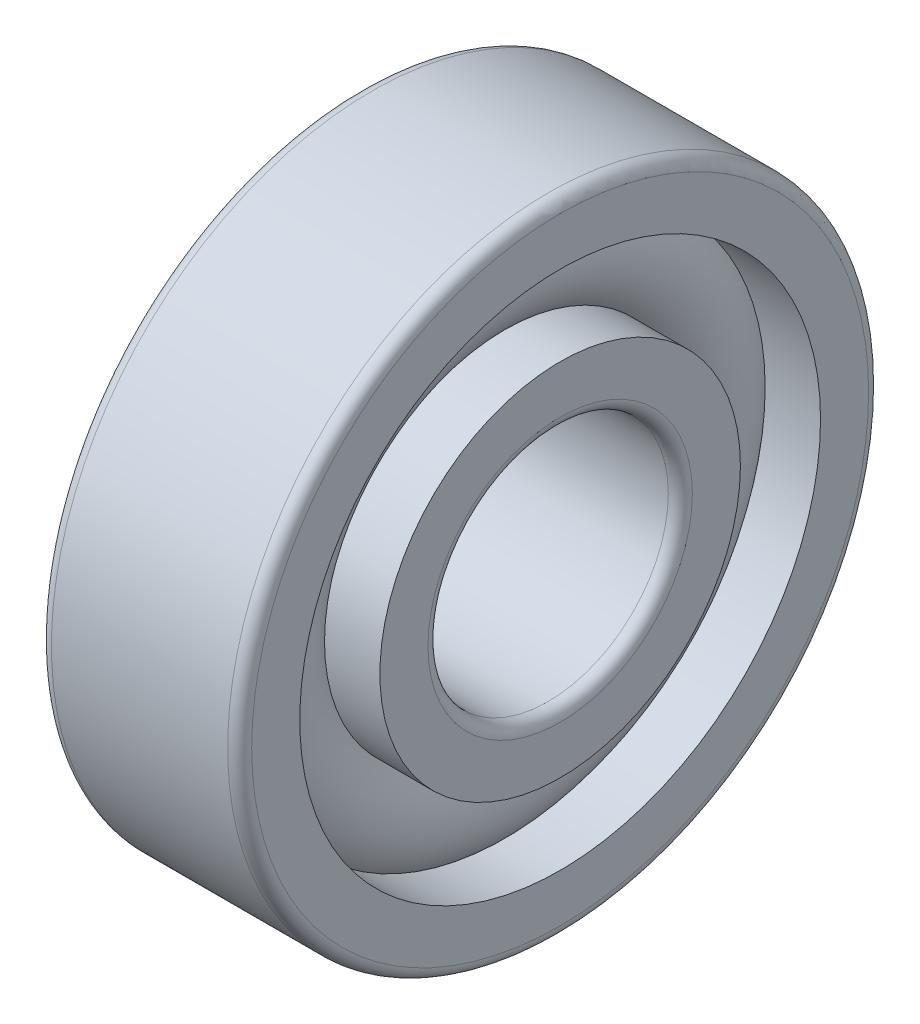
ISO-10303-21;
HEADER;
FILE_DESCRIPTION(('STEP AP214'),'2;1');
FILE_NAME('part.step','',(''),(''),'','','');
FILE_SCHEMA(('AUTOMOTIVE_DESIGN { 1 0 10303 214 1 1 1 1 }'));
ENDSEC;
DATA;
#1=APPLICATION_CONTEXT('core data for automotive mechanical design processes');
#2=APPLICATION_PROTOCOL_DEFINITION('international standard','automotive_design',2000,#1);
#3=PRODUCT_CONTEXT('',#1,'mechanical');
#4=PRODUCT('Part','Part','',(#3));
#5=PRODUCT_RELATED_PRODUCT_CATEGORY('part','',(#4));
#6=PRODUCT_DEFINITION_FORMATION('','',#4);
#7=PRODUCT_DEFINITION_CONTEXT('part definition',#1,'design');
#8=PRODUCT_DEFINITION('design','',#6,#7);
#9=PRODUCT_DEFINITION_SHAPE('','',#8);
#10=(LENGTH_UNIT() NAMED_UNIT(*) SI_UNIT(.MILLI.,.METRE.));
#11=(NAMED_UNIT(*) PLANE_ANGLE_UNIT() SI_UNIT($,.RADIAN.));
#12=(NAMED_UNIT(*) SI_UNIT($,.STERADIAN.) SOLID_ANGLE_UNIT());
#13=UNCERTAINTY_MEASURE_WITH_UNIT(LENGTH_MEASURE(1.E-05),#10,'distance_accuracy_value','');
#14=(GEOMETRIC_REPRESENTATION_CONTEXT(3) GLOBAL_UNCERTAINTY_ASSIGNED_CONTEXT((#13)) GLOBAL_UNIT_ASSIGNED_CONTEXT((#10,
#11,#12)) REPRESENTATION_CONTEXT('',''));
#15=CARTESIAN_POINT('',(0.,0.,0.));
#16=DIRECTION('',(0.,0.,1.));
#17=DIRECTION('',(1.,0.,0.));
#18=AXIS2_PLACEMENT_3D('',#15,#16,#17);
#19=CARTESIAN_POINT('',(0.,0.,0.));
#20=DIRECTION('',(-1.,0.,0.));
#21=DIRECTION('',(0.,0.,1.));
#22=AXIS2_PLACEMENT_3D('',#19,#20,#21);
#23=TOROIDAL_SURFACE('',#22,11.,3.);
#24=CARTESIAN_POINT('',(2.23606797749979,0.,0.));
#25=DIRECTION('',(-1.,0.,0.));
#26=DIRECTION('',(0.,0.,1.));
#27=AXIS2_PLACEMENT_3D('',#24,#25,#26);
#28=CIRCLE('',#27,13.);
#29=CARTESIAN_POINT('',(2.23606797749979,0.,13.));
#30=VERTEX_POINT('',#29);
#31=EDGE_CURVE('E40',#30,#30,#28,.F.);
#32=ORIENTED_EDGE('',*,*,#31,.T.);
#33=EDGE_LOOP('',(#32));
#34=FACE_BOUND('',#33,.T.);
#35=CARTESIAN_POINT('',(2.23606797749979,0.,0.));
#36=DIRECTION('',(-1.,0.,0.));
#37=DIRECTION('',(0.,0.,1.));
#38=AXIS2_PLACEMENT_3D('',#35,#36,#37);
#39=CIRCLE('',#38,9.);
#40=CARTESIAN_POINT('',(2.23606797749979,0.,9.));
#41=VERTEX_POINT('',#40);
#42=EDGE_CURVE('E10',#41,#41,#39,.T.);
#43=ORIENTED_EDGE('',*,*,#42,.T.);
#44=EDGE_LOOP('',(#43));
#45=FACE_BOUND('',#44,.T.);
#46=ADVANCED_FACE('F36',(#34,#45),#23,.T.);
#47=CARTESIAN_POINT('',(-20.6375,0.,0.));
#48=DIRECTION('',(1.,0.,0.));
#49=DIRECTION('',(0.,0.,-1.));
#50=AXIS2_PLACEMENT_3D('',#47,#48,#49);
#51=CYLINDRICAL_SURFACE('',#50,9.);
#52=CARTESIAN_POINT('',(5.,0.,0.));
#53=DIRECTION('',(1.,0.,0.));
#54=DIRECTION('',(0.,0.,-1.));
#55=AXIS2_PLACEMENT_3D('',#52,#53,#54);
#56=CIRCLE('',#55,9.);
#57=CARTESIAN_POINT('',(5.,0.,-9.));
#58=VERTEX_POINT('',#57);
#59=EDGE_CURVE('E49',#58,#58,#56,.T.);
#60=ORIENTED_EDGE('',*,*,#59,.F.);
#61=EDGE_LOOP('',(#60));
#62=FACE_BOUND('',#61,.T.);
#63=ORIENTED_EDGE('',*,*,#42,.F.);
#64=EDGE_LOOP('',(#63));
#65=FACE_BOUND('',#64,.T.);
#66=ADVANCED_FACE('F88',(#62,#65),#51,.T.);
#67=CARTESIAN_POINT('',(-20.6375,0.,0.));
#68=DIRECTION('',(1.,0.,0.));
#69=DIRECTION('',(0.,0.,-1.));
#70=AXIS2_PLACEMENT_3D('',#67,#68,#69);
#71=CYLINDRICAL_SURFACE('',#70,9.);
#72=CARTESIAN_POINT('',(-5.,0.,0.));
#73=DIRECTION('',(1.,0.,0.));
#74=DIRECTION('',(0.,0.,-1.));
#75=AXIS2_PLACEMENT_3D('',#72,#73,#74);
#76=CIRCLE('',#75,9.);
#77=CARTESIAN_POINT('',(-5.,0.,-9.));
#78=VERTEX_POINT('',#77);
#79=EDGE_CURVE('E58',#78,#78,#76,.T.);
#80=ORIENTED_EDGE('',*,*,#79,.T.);
#81=EDGE_LOOP('',(#80));
#82=FACE_BOUND('',#81,.T.);
#83=CARTESIAN_POINT('',(-2.23606797749979,0.,0.));
#84=DIRECTION('',(1.,0.,0.));
#85=DIRECTION('',(0.,0.,-1.));
#86=AXIS2_PLACEMENT_3D('',#83,#84,#85);
#87=CIRCLE('',#86,9.);
#88=CARTESIAN_POINT('',(-2.23606797749979,0.,-9.));
#89=VERTEX_POINT('',#88);
#90=EDGE_CURVE('E44',#89,#89,#87,.T.);
#91=ORIENTED_EDGE('',*,*,#90,.F.);
#92=EDGE_LOOP('',(#91));
#93=FACE_BOUND('',#92,.T.);
#94=ADVANCED_FACE('F91',(#82,#93),#71,.T.);
#95=CARTESIAN_POINT('',(5.,6.6,0.));
#96=DIRECTION('',(1.,0.,0.));
#97=DIRECTION('',(0.,0.,-1.));
#98=AXIS2_PLACEMENT_3D('',#95,#96,#97);
#99=PLANE('',#98);
#100=ORIENTED_EDGE('',*,*,#59,.T.);
#101=EDGE_LOOP('',(#100));
#102=FACE_BOUND('',#101,.T.);
#103=CARTESIAN_POINT('',(5.,0.,0.));
#104=DIRECTION('',(1.,0.,0.));
#105=DIRECTION('',(0.,0.,-1.));
#106=AXIS2_PLACEMENT_3D('',#103,#104,#105);
#107=CIRCLE('',#106,6.6);
#108=CARTESIAN_POINT('',(5.,0.,-6.6));
#109=VERTEX_POINT('',#108);
#110=EDGE_CURVE('E80',#109,#109,#107,.T.);
#111=ORIENTED_EDGE('',*,*,#110,.F.);
#112=EDGE_LOOP('',(#111));
#113=FACE_BOUND('',#112,.T.);
#114=ADVANCED_FACE('F85',(#102,#113),#99,.T.);
#115=CARTESIAN_POINT('',(4.4,0.,0.));
#116=DIRECTION('',(1.,0.,0.));
#117=DIRECTION('',(0.,0.,-1.));
#118=AXIS2_PLACEMENT_3D('',#115,#116,#117);
#119=TOROIDAL_SURFACE('',#118,6.6,0.599999999999999);
#120=ORIENTED_EDGE('',*,*,#110,.T.);
#121=EDGE_LOOP('',(#120));
#122=FACE_BOUND('',#121,.T.);
#123=CARTESIAN_POINT('',(4.4,0.,0.));
#124=DIRECTION('',(1.,0.,0.));
#125=DIRECTION('',(0.,0.,-1.));
#126=AXIS2_PLACEMENT_3D('',#123,#124,#125);
#127=CIRCLE('',#126,6.);
#128=CARTESIAN_POINT('',(4.4,0.,-6.));
#129=VERTEX_POINT('',#128);
#130=EDGE_CURVE('E77',#129,#129,#127,.T.);
#131=ORIENTED_EDGE('',*,*,#130,.F.);
#132=EDGE_LOOP('',(#131));
#133=FACE_BOUND('',#132,.T.);
#134=ADVANCED_FACE('F102',(#122,#133),#119,.T.);
#135=CARTESIAN_POINT('',(-20.6375,0.,0.));
#136=DIRECTION('',(1.,0.,0.));
#137=DIRECTION('',(0.,0.,-1.));
#138=AXIS2_PLACEMENT_3D('',#135,#136,#137);
#139=CYLINDRICAL_SURFACE('',#138,6.);
#140=ORIENTED_EDGE('',*,*,#130,.T.);
#141=EDGE_LOOP('',(#140));
#142=FACE_BOUND('',#141,.T.);
#143=CARTESIAN_POINT('',(-4.4,0.,0.));
#144=DIRECTION('',(1.,0.,0.));
#145=DIRECTION('',(0.,0.,-1.));
#146=AXIS2_PLACEMENT_3D('',#143,#144,#145);
#147=CIRCLE('',#146,6.);
#148=CARTESIAN_POINT('',(-4.4,0.,-6.));
#149=VERTEX_POINT('',#148);
#150=EDGE_CURVE('E74',#149,#149,#147,.T.);
#151=ORIENTED_EDGE('',*,*,#150,.F.);
#152=EDGE_LOOP('',(#151));
#153=FACE_BOUND('',#152,.T.);
#154=ADVANCED_FACE('F105',(#142,#153),#139,.F.);
#155=CARTESIAN_POINT('',(-4.4,0.,0.));
#156=DIRECTION('',(1.,0.,0.));
#157=DIRECTION('',(0.,0.,-1.));
#158=AXIS2_PLACEMENT_3D('',#155,#156,#157);
#159=TOROIDAL_SURFACE('',#158,6.6,0.599999999999999);
#160=ORIENTED_EDGE('',*,*,#150,.T.);
#161=EDGE_LOOP('',(#160));
#162=FACE_BOUND('',#161,.T.);
#163=CARTESIAN_POINT('',(-5.,0.,0.));
#164=DIRECTION('',(1.,0.,0.));
#165=DIRECTION('',(0.,0.,-1.));
#166=AXIS2_PLACEMENT_3D('',#163,#164,#165);
#167=CIRCLE('',#166,6.6);
#168=CARTESIAN_POINT('',(-5.,0.,-6.6));
#169=VERTEX_POINT('',#168);
#170=EDGE_CURVE('E71',#169,#169,#167,.T.);
#171=ORIENTED_EDGE('',*,*,#170,.F.);
#172=EDGE_LOOP('',(#171));
#173=FACE_BOUND('',#172,.T.);
#174=ADVANCED_FACE('F109',(#162,#173),#159,.T.);
#175=CARTESIAN_POINT('',(-5.,9.,0.));
#176=DIRECTION('',(-1.,0.,0.));
#177=DIRECTION('',(0.,0.,1.));
#178=AXIS2_PLACEMENT_3D('',#175,#176,#177);
#179=PLANE('',#178);
#180=ORIENTED_EDGE('',*,*,#170,.T.);
#181=EDGE_LOOP('',(#180));
#182=FACE_BOUND('',#181,.T.);
#183=ORIENTED_EDGE('',*,*,#79,.F.);
#184=EDGE_LOOP('',(#183));
#185=FACE_BOUND('',#184,.T.);
#186=ADVANCED_FACE('F113',(#182,#185),#179,.T.);
#187=CARTESIAN_POINT('',(-2.23606797749979,0.,0.));
#188=DIRECTION('',(1.,0.,0.));
#189=DIRECTION('',(0.,0.,-1.));
#190=AXIS2_PLACEMENT_3D('',#187,#188,#189);
#191=CIRCLE('',#190,13.);
#192=CARTESIAN_POINT('',(-2.23606797749979,0.,-13.));
#193=VERTEX_POINT('',#192);
#194=EDGE_CURVE('E52',#193,#193,#191,.F.);
#195=ORIENTED_EDGE('',*,*,#194,.T.);
#196=EDGE_LOOP('',(#195));
#197=FACE_BOUND('',#196,.T.);
#198=ORIENTED_EDGE('',*,*,#90,.T.);
#199=EDGE_LOOP('',(#198));
#200=FACE_BOUND('',#199,.T.);
#201=ADVANCED_FACE('F38',(#197,#200),#23,.T.);
#202=CARTESIAN_POINT('',(-20.6375,0.,0.));
#203=DIRECTION('',(1.,0.,0.));
#204=DIRECTION('',(0.,0.,-1.));
#205=AXIS2_PLACEMENT_3D('',#202,#203,#204);
#206=CYLINDRICAL_SURFACE('',#205,13.);
#207=CARTESIAN_POINT('',(5.,0.,0.));
#208=DIRECTION('',(1.,0.,0.));
#209=DIRECTION('',(0.,0.,-1.));
#210=AXIS2_PLACEMENT_3D('',#207,#208,#209);
#211=CIRCLE('',#210,13.);
#212=CARTESIAN_POINT('',(5.,0.,-13.));
#213=VERTEX_POINT('',#212);
#214=EDGE_CURVE('E54',#213,#213,#211,.T.);
#215=ORIENTED_EDGE('',*,*,#214,.T.);
#216=EDGE_LOOP('',(#215));
#217=FACE_BOUND('',#216,.T.);
#218=ORIENTED_EDGE('',*,*,#31,.F.);
#219=EDGE_LOOP('',(#218));
#220=FACE_BOUND('',#219,.T.);
#221=ADVANCED_FACE('F118',(#217,#220),#206,.F.);
#222=CARTESIAN_POINT('',(-20.6375,0.,0.));
#223=DIRECTION('',(1.,0.,0.));
#224=DIRECTION('',(0.,0.,-1.));
#225=AXIS2_PLACEMENT_3D('',#222,#223,#224);
#226=CYLINDRICAL_SURFACE('',#225,13.);
#227=CARTESIAN_POINT('',(-5.,0.,0.));
#228=DIRECTION('',(1.,0.,0.));
#229=DIRECTION('',(0.,0.,-1.));
#230=AXIS2_PLACEMENT_3D('',#227,#228,#229);
#231=CIRCLE('',#230,13.);
#232=CARTESIAN_POINT('',(-5.,0.,-13.));
#233=VERTEX_POINT('',#232);
#234=EDGE_CURVE('E149',#233,#233,#231,.T.);
#235=ORIENTED_EDGE('',*,*,#234,.F.);
#236=EDGE_LOOP('',(#235));
#237=FACE_BOUND('',#236,.T.);
#238=ORIENTED_EDGE('',*,*,#194,.F.);
#239=EDGE_LOOP('',(#238));
#240=FACE_BOUND('',#239,.T.);
#241=ADVANCED_FACE('F121',(#237,#240),#226,.F.);
#242=CARTESIAN_POINT('',(5.,15.4,0.));
#243=DIRECTION('',(1.,0.,0.));
#244=DIRECTION('',(0.,0.,-1.));
#245=AXIS2_PLACEMENT_3D('',#242,#243,#244);
#246=PLANE('',#245);
#247=CARTESIAN_POINT('',(5.,0.,0.));
#248=DIRECTION('',(1.,0.,0.));
#249=DIRECTION('',(0.,0.,-1.));
#250=AXIS2_PLACEMENT_3D('',#247,#248,#249);
#251=CIRCLE('',#250,15.4);
#252=CARTESIAN_POINT('',(5.,0.,-15.4));
#253=VERTEX_POINT('',#252);
#254=EDGE_CURVE('E60',#253,#253,#251,.T.);
#255=ORIENTED_EDGE('',*,*,#254,.T.);
#256=EDGE_LOOP('',(#255));
#257=FACE_BOUND('',#256,.T.);
#258=ORIENTED_EDGE('',*,*,#214,.F.);
#259=EDGE_LOOP('',(#258));
#260=FACE_BOUND('',#259,.T.);
#261=ADVANCED_FACE('F122',(#257,#260),#246,.T.);
#262=CARTESIAN_POINT('',(4.4,0.,0.));
#263=DIRECTION('',(1.,0.,0.));
#264=DIRECTION('',(0.,0.,-1.));
#265=AXIS2_PLACEMENT_3D('',#262,#263,#264);
#266=TOROIDAL_SURFACE('',#265,15.4,0.600000000000001);
#267=CARTESIAN_POINT('',(4.4,0.,0.));
#268=DIRECTION('',(1.,0.,0.));
#269=DIRECTION('',(0.,0.,-1.));
#270=AXIS2_PLACEMENT_3D('',#267,#268,#269);
#271=CIRCLE('',#270,16.);
#272=CARTESIAN_POINT('',(4.4,0.,-16.));
#273=VERTEX_POINT('',#272);
#274=EDGE_CURVE('E65',#273,#273,#271,.T.);
#275=ORIENTED_EDGE('',*,*,#274,.T.);
#276=EDGE_LOOP('',(#275));
#277=FACE_BOUND('',#276,.T.);
#278=ORIENTED_EDGE('',*,*,#254,.F.);
#279=EDGE_LOOP('',(#278));
#280=FACE_BOUND('',#279,.T.);
#281=ADVANCED_FACE('F125',(#277,#280),#266,.T.);
#282=CARTESIAN_POINT('',(-20.6375,0.,0.));
#283=DIRECTION('',(1.,0.,0.));
#284=DIRECTION('',(0.,0.,-1.));
#285=AXIS2_PLACEMENT_3D('',#282,#283,#284);
#286=CYLINDRICAL_SURFACE('',#285,16.);
#287=CARTESIAN_POINT('',(-4.4,0.,0.));
#288=DIRECTION('',(1.,0.,0.));
#289=DIRECTION('',(0.,0.,-1.));
#290=AXIS2_PLACEMENT_3D('',#287,#288,#289);
#291=CIRCLE('',#290,16.);
#292=CARTESIAN_POINT('',(-4.4,0.,-16.));
#293=VERTEX_POINT('',#292);
#294=EDGE_CURVE('E153',#293,#293,#291,.T.);
#295=ORIENTED_EDGE('',*,*,#294,.T.);
#296=EDGE_LOOP('',(#295));
#297=FACE_BOUND('',#296,.T.);
#298=ORIENTED_EDGE('',*,*,#274,.F.);
#299=EDGE_LOOP('',(#298));
#300=FACE_BOUND('',#299,.T.);
#301=ADVANCED_FACE('F129',(#297,#300),#286,.T.);
#302=CARTESIAN_POINT('',(-4.4,0.,0.));
#303=DIRECTION('',(1.,0.,0.));
#304=DIRECTION('',(0.,0.,-1.));
#305=AXIS2_PLACEMENT_3D('',#302,#303,#304);
#306=TOROIDAL_SURFACE('',#305,15.4,0.600000000000001);
#307=CARTESIAN_POINT('',(-5.,0.,0.));
#308=DIRECTION('',(1.,0.,0.));
#309=DIRECTION('',(0.,0.,-1.));
#310=AXIS2_PLACEMENT_3D('',#307,#308,#309);
#311=CIRCLE('',#310,15.4);
#312=CARTESIAN_POINT('',(-5.,0.,-15.4));
#313=VERTEX_POINT('',#312);
#314=EDGE_CURVE('E150',#313,#313,#311,.T.);
#315=ORIENTED_EDGE('',*,*,#314,.T.);
#316=EDGE_LOOP('',(#315));
#317=FACE_BOUND('',#316,.T.);
#318=ORIENTED_EDGE('',*,*,#294,.F.);
#319=EDGE_LOOP('',(#318));
#320=FACE_BOUND('',#319,.T.);
#321=ADVANCED_FACE('F133',(#317,#320),#306,.T.);
#322=CARTESIAN_POINT('',(-5.,13.,0.));
#323=DIRECTION('',(-1.,0.,0.));
#324=DIRECTION('',(0.,0.,1.));
#325=AXIS2_PLACEMENT_3D('',#322,#323,#324);
#326=PLANE('',#325);
#327=ORIENTED_EDGE('',*,*,#234,.T.);
#328=EDGE_LOOP('',(#327));
#329=FACE_BOUND('',#328,.T.);
#330=ORIENTED_EDGE('',*,*,#314,.F.);
#331=EDGE_LOOP('',(#330));
#332=FACE_BOUND('',#331,.T.);
#333=ADVANCED_FACE('F137',(#329,#332),#326,.T.);
#334=CLOSED_SHELL('',(#46,#66,#94,#114,#134,#154,#174,#186,#201,#221,#241,#261,#281,#301,#321,#333));
#335=MANIFOLD_SOLID_BREP('B2',#334);
#336=ADVANCED_BREP_SHAPE_REPRESENTATION('',(#18,#335),#14);
#337=SHAPE_DEFINITION_REPRESENTATION(#9,#336);
ENDSEC;
END-ISO-10303-21;
